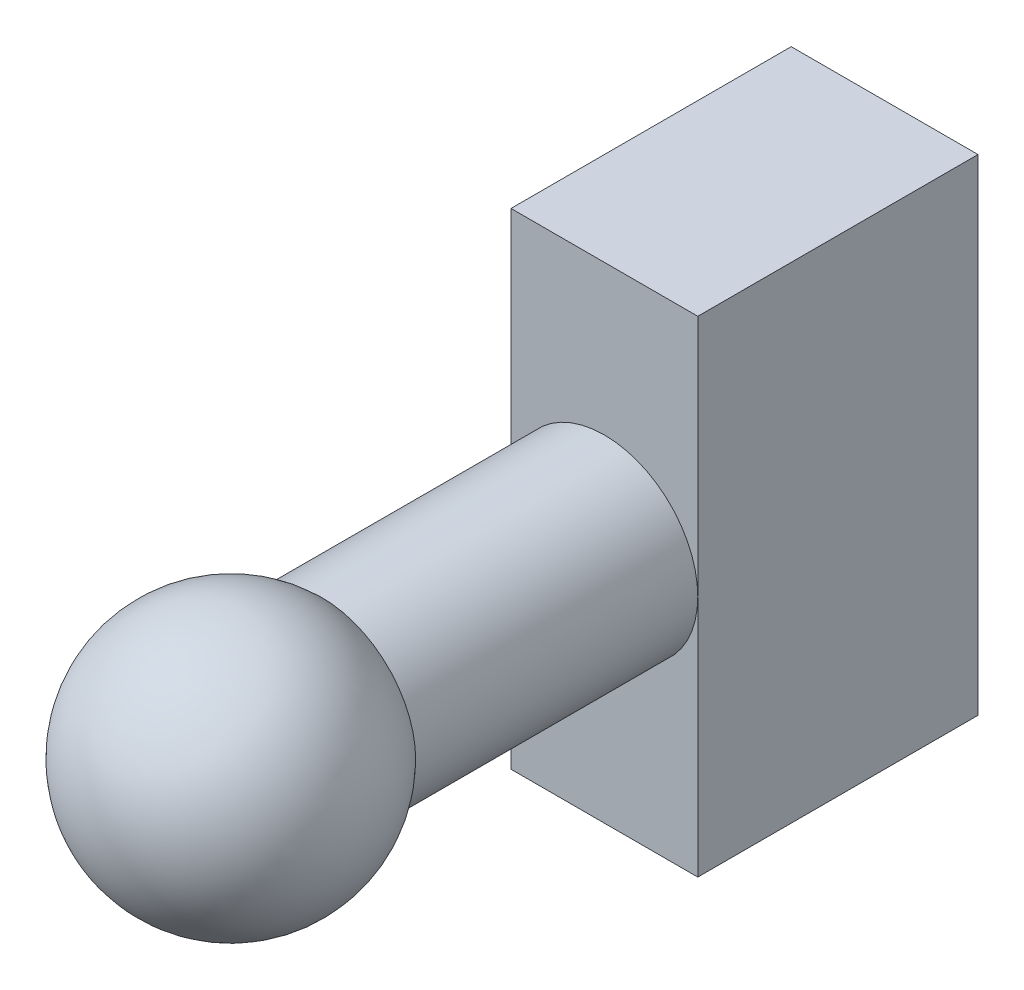
ISO-10303-21;
HEADER;
FILE_DESCRIPTION(('STEP AP214'),'2;1');
FILE_NAME('part.step','',(''),(''),'','','');
FILE_SCHEMA(('AUTOMOTIVE_DESIGN { 1 0 10303 214 1 1 1 1 }'));
ENDSEC;
DATA;
#1=APPLICATION_CONTEXT('core data for automotive mechanical design processes');
#2=APPLICATION_PROTOCOL_DEFINITION('international standard','automotive_design',2000,#1);
#3=PRODUCT_CONTEXT('',#1,'mechanical');
#4=PRODUCT('Part','Part','',(#3));
#5=PRODUCT_RELATED_PRODUCT_CATEGORY('part','',(#4));
#6=PRODUCT_DEFINITION_FORMATION('','',#4);
#7=PRODUCT_DEFINITION_CONTEXT('part definition',#1,'design');
#8=PRODUCT_DEFINITION('design','',#6,#7);
#9=PRODUCT_DEFINITION_SHAPE('','',#8);
#10=(LENGTH_UNIT() NAMED_UNIT(*) SI_UNIT(.MILLI.,.METRE.));
#11=(NAMED_UNIT(*) PLANE_ANGLE_UNIT() SI_UNIT($,.RADIAN.));
#12=(NAMED_UNIT(*) SI_UNIT($,.STERADIAN.) SOLID_ANGLE_UNIT());
#13=UNCERTAINTY_MEASURE_WITH_UNIT(LENGTH_MEASURE(1.E-05),#10,'distance_accuracy_value','');
#14=(GEOMETRIC_REPRESENTATION_CONTEXT(3) GLOBAL_UNCERTAINTY_ASSIGNED_CONTEXT((#13)) GLOBAL_UNIT_ASSIGNED_CONTEXT((#10,
#11,#12)) REPRESENTATION_CONTEXT('',''));
#15=CARTESIAN_POINT('',(0.,0.,0.));
#16=DIRECTION('',(0.,0.,1.));
#17=DIRECTION('',(1.,0.,0.));
#18=AXIS2_PLACEMENT_3D('',#15,#16,#17);
#19=CARTESIAN_POINT('',(0.,0.,35.));
#20=DIRECTION('',(0.,0.,-1.));
#21=DIRECTION('',(-1.,0.,0.));
#22=AXIS2_PLACEMENT_3D('',#19,#20,#21);
#23=CYLINDRICAL_SURFACE('',#22,5.);
#24=CARTESIAN_POINT('',(0.,0.,15.));
#25=DIRECTION('',(0.,0.,1.));
#26=DIRECTION('',(1.,0.,0.));
#27=AXIS2_PLACEMENT_3D('',#24,#25,#26);
#28=CIRCLE('',#27,5.);
#29=CARTESIAN_POINT('',(5.,0.,15.));
#30=VERTEX_POINT('',#29);
#31=CARTESIAN_POINT('',(-5.,0.,15.));
#32=VERTEX_POINT('',#31);
#33=EDGE_CURVE('E101',#30,#32,#28,.T.);
#34=ORIENTED_EDGE('',*,*,#33,.T.);
#35=EDGE_CURVE('E43',#32,#30,#28,.T.);
#36=ORIENTED_EDGE('',*,*,#35,.T.);
#37=EDGE_LOOP('',(#34,#36));
#38=FACE_BOUND('',#37,.T.);
#39=CARTESIAN_POINT('',(0.,0.,30.1010205144336));
#40=DIRECTION('',(0.,0.,1.));
#41=DIRECTION('',(1.,0.,0.));
#42=AXIS2_PLACEMENT_3D('',#39,#40,#41);
#43=CIRCLE('',#42,5.);
#44=CARTESIAN_POINT('',(5.,0.,30.1010205144336));
#45=VERTEX_POINT('',#44);
#46=EDGE_CURVE('E11',#45,#45,#43,.T.);
#47=ORIENTED_EDGE('',*,*,#46,.F.);
#48=EDGE_LOOP('',(#47));
#49=FACE_BOUND('',#48,.T.);
#50=ADVANCED_FACE('F35',(#38,#49),#23,.T.);
#51=CARTESIAN_POINT('',(0.,0.,15.));
#52=DIRECTION('',(0.,0.,1.));
#53=DIRECTION('',(1.,0.,0.));
#54=AXIS2_PLACEMENT_3D('',#51,#52,#53);
#55=PLANE('',#54);
#56=ORIENTED_EDGE('',*,*,#33,.F.);
#57=DIRECTION('',(0.,1.,0.));
#58=VECTOR('',#57,1.);
#59=CARTESIAN_POINT('',(5.,-13.,15.));
#60=LINE('',#59,#58);
#61=CARTESIAN_POINT('',(5.,13.,15.));
#62=VERTEX_POINT('',#61);
#63=EDGE_CURVE('E94',#30,#62,#60,.T.);
#64=ORIENTED_EDGE('',*,*,#63,.T.);
#65=DIRECTION('',(-1.,0.,0.));
#66=VECTOR('',#65,1.);
#67=CARTESIAN_POINT('',(5.,13.,15.));
#68=LINE('',#67,#66);
#69=CARTESIAN_POINT('',(-5.,13.,15.));
#70=VERTEX_POINT('',#69);
#71=EDGE_CURVE('E58',#62,#70,#68,.T.);
#72=ORIENTED_EDGE('',*,*,#71,.T.);
#73=DIRECTION('',(0.,-1.,0.));
#74=VECTOR('',#73,1.);
#75=CARTESIAN_POINT('',(-5.,-13.,15.));
#76=LINE('',#75,#74);
#77=EDGE_CURVE('E104',#70,#32,#76,.T.);
#78=ORIENTED_EDGE('',*,*,#77,.T.);
#79=EDGE_LOOP('',(#56,#64,#72,#78));
#80=FACE_BOUND('',#79,.T.);
#81=ADVANCED_FACE('F102',(#80),#55,.T.);
#82=CARTESIAN_POINT('',(-5.,-13.,15.));
#83=DIRECTION('',(1.,0.,0.));
#84=DIRECTION('',(0.,0.,-1.));
#85=AXIS2_PLACEMENT_3D('',#82,#83,#84);
#86=PLANE('',#85);
#87=DIRECTION('',(0.,-1.,0.));
#88=VECTOR('',#87,1.);
#89=CARTESIAN_POINT('',(-5.,-13.,0.));
#90=LINE('',#89,#88);
#91=CARTESIAN_POINT('',(-5.,13.,0.));
#92=VERTEX_POINT('',#91);
#93=CARTESIAN_POINT('',(-5.,-13.,0.));
#94=VERTEX_POINT('',#93);
#95=EDGE_CURVE('E106',#92,#94,#90,.T.);
#96=ORIENTED_EDGE('',*,*,#95,.T.);
#97=DIRECTION('',(0.,0.,-1.));
#98=VECTOR('',#97,1.);
#99=CARTESIAN_POINT('',(-5.,-13.,15.));
#100=LINE('',#99,#98);
#101=CARTESIAN_POINT('',(-5.,-13.,15.));
#102=VERTEX_POINT('',#101);
#103=EDGE_CURVE('E109',#102,#94,#100,.T.);
#104=ORIENTED_EDGE('',*,*,#103,.F.);
#105=EDGE_CURVE('E83',#32,#102,#76,.T.);
#106=ORIENTED_EDGE('',*,*,#105,.F.);
#107=ORIENTED_EDGE('',*,*,#77,.F.);
#108=DIRECTION('',(0.,0.,-1.));
#109=VECTOR('',#108,1.);
#110=CARTESIAN_POINT('',(-5.,13.,15.));
#111=LINE('',#110,#109);
#112=EDGE_CURVE('E116',#70,#92,#111,.T.);
#113=ORIENTED_EDGE('',*,*,#112,.T.);
#114=EDGE_LOOP('',(#96,#104,#106,#107,#113));
#115=FACE_BOUND('',#114,.T.);
#116=ADVANCED_FACE('F37',(#115),#86,.F.);
#117=CARTESIAN_POINT('',(5.,-13.,15.));
#118=DIRECTION('',(0.,1.,0.));
#119=DIRECTION('',(-1.,0.,0.));
#120=AXIS2_PLACEMENT_3D('',#117,#118,#119);
#121=PLANE('',#120);
#122=DIRECTION('',(1.,0.,0.));
#123=VECTOR('',#122,1.);
#124=CARTESIAN_POINT('',(5.,-13.,0.));
#125=LINE('',#124,#123);
#126=CARTESIAN_POINT('',(5.,-13.,0.));
#127=VERTEX_POINT('',#126);
#128=EDGE_CURVE('E119',#94,#127,#125,.T.);
#129=ORIENTED_EDGE('',*,*,#128,.T.);
#130=DIRECTION('',(0.,0.,-1.));
#131=VECTOR('',#130,1.);
#132=CARTESIAN_POINT('',(5.,-13.,15.));
#133=LINE('',#132,#131);
#134=CARTESIAN_POINT('',(5.,-13.,15.));
#135=VERTEX_POINT('',#134);
#136=EDGE_CURVE('E111',#135,#127,#133,.T.);
#137=ORIENTED_EDGE('',*,*,#136,.F.);
#138=DIRECTION('',(1.,0.,0.));
#139=VECTOR('',#138,1.);
#140=CARTESIAN_POINT('',(5.,-13.,15.));
#141=LINE('',#140,#139);
#142=EDGE_CURVE('E90',#102,#135,#141,.T.);
#143=ORIENTED_EDGE('',*,*,#142,.F.);
#144=ORIENTED_EDGE('',*,*,#103,.T.);
#145=EDGE_LOOP('',(#129,#137,#143,#144));
#146=FACE_BOUND('',#145,.T.);
#147=ADVANCED_FACE('F141',(#146),#121,.F.);
#148=CARTESIAN_POINT('',(5.,-13.,15.));
#149=DIRECTION('',(-1.,0.,0.));
#150=DIRECTION('',(0.,0.,1.));
#151=AXIS2_PLACEMENT_3D('',#148,#149,#150);
#152=PLANE('',#151);
#153=DIRECTION('',(0.,1.,0.));
#154=VECTOR('',#153,1.);
#155=CARTESIAN_POINT('',(5.,-13.,0.));
#156=LINE('',#155,#154);
#157=CARTESIAN_POINT('',(5.,13.,0.));
#158=VERTEX_POINT('',#157);
#159=EDGE_CURVE('E121',#127,#158,#156,.T.);
#160=ORIENTED_EDGE('',*,*,#159,.T.);
#161=DIRECTION('',(0.,0.,-1.));
#162=VECTOR('',#161,1.);
#163=CARTESIAN_POINT('',(5.,13.,15.));
#164=LINE('',#163,#162);
#165=EDGE_CURVE('E99',#62,#158,#164,.T.);
#166=ORIENTED_EDGE('',*,*,#165,.F.);
#167=ORIENTED_EDGE('',*,*,#63,.F.);
#168=EDGE_CURVE('E87',#135,#30,#60,.T.);
#169=ORIENTED_EDGE('',*,*,#168,.F.);
#170=ORIENTED_EDGE('',*,*,#136,.T.);
#171=EDGE_LOOP('',(#160,#166,#167,#169,#170));
#172=FACE_BOUND('',#171,.T.);
#173=ADVANCED_FACE('F98',(#172),#152,.F.);
#174=CARTESIAN_POINT('',(5.,13.,15.));
#175=DIRECTION('',(0.,-1.,0.));
#176=DIRECTION('',(1.,0.,0.));
#177=AXIS2_PLACEMENT_3D('',#174,#175,#176);
#178=PLANE('',#177);
#179=DIRECTION('',(-1.,0.,0.));
#180=VECTOR('',#179,1.);
#181=CARTESIAN_POINT('',(5.,13.,0.));
#182=LINE('',#181,#180);
#183=EDGE_CURVE('E79',#158,#92,#182,.T.);
#184=ORIENTED_EDGE('',*,*,#183,.T.);
#185=ORIENTED_EDGE('',*,*,#112,.F.);
#186=ORIENTED_EDGE('',*,*,#71,.F.);
#187=ORIENTED_EDGE('',*,*,#165,.T.);
#188=EDGE_LOOP('',(#184,#185,#186,#187));
#189=FACE_BOUND('',#188,.T.);
#190=ADVANCED_FACE('F133',(#189),#178,.F.);
#191=ORIENTED_EDGE('',*,*,#35,.F.);
#192=ORIENTED_EDGE('',*,*,#105,.T.);
#193=ORIENTED_EDGE('',*,*,#142,.T.);
#194=ORIENTED_EDGE('',*,*,#168,.T.);
#195=EDGE_LOOP('',(#191,#192,#193,#194));
#196=FACE_BOUND('',#195,.T.);
#197=ADVANCED_FACE('F89',(#196),#55,.T.);
#198=CARTESIAN_POINT('',(0.,0.,0.));
#199=DIRECTION('',(0.,0.,1.));
#200=DIRECTION('',(1.,0.,0.));
#201=AXIS2_PLACEMENT_3D('',#198,#199,#200);
#202=PLANE('',#201);
#203=ORIENTED_EDGE('',*,*,#95,.F.);
#204=ORIENTED_EDGE('',*,*,#183,.F.);
#205=ORIENTED_EDGE('',*,*,#159,.F.);
#206=ORIENTED_EDGE('',*,*,#128,.F.);
#207=EDGE_LOOP('',(#203,#204,#205,#206));
#208=FACE_BOUND('',#207,.T.);
#209=ADVANCED_FACE('F130',(#208),#202,.F.);
#210=CARTESIAN_POINT('',(0.,0.,35.));
#211=DIRECTION('',(-1.,0.,0.));
#212=DIRECTION('',(0.,1.,0.));
#213=AXIS2_PLACEMENT_3D('',#210,#211,#212);
#214=SPHERICAL_SURFACE('',#213,7.);
#215=CARTESIAN_POINT('',(0.,0.,35.));
#216=DIRECTION('',(0.,0.,1.));
#217=DIRECTION('',(1.,0.,0.));
#218=AXIS2_PLACEMENT_3D('',#215,#216,#217);
#219=SPHERICAL_SURFACE('',#218,7.);
#220=ORIENTED_EDGE('',*,*,#46,.T.);
#221=EDGE_LOOP('',(#220));
#222=FACE_BOUND('',#221,.T.);
#223=ADVANCED_FACE('F150',(#222),#219,.T.);
#224=CLOSED_SHELL('',(#50,#81,#116,#147,#173,#190,#197,#209,#223));
#225=MANIFOLD_SOLID_BREP('B2',#224);
#226=ADVANCED_BREP_SHAPE_REPRESENTATION('',(#18,#225),#14);
#227=SHAPE_DEFINITION_REPRESENTATION(#9,#226);
ENDSEC;
END-ISO-10303-21;
